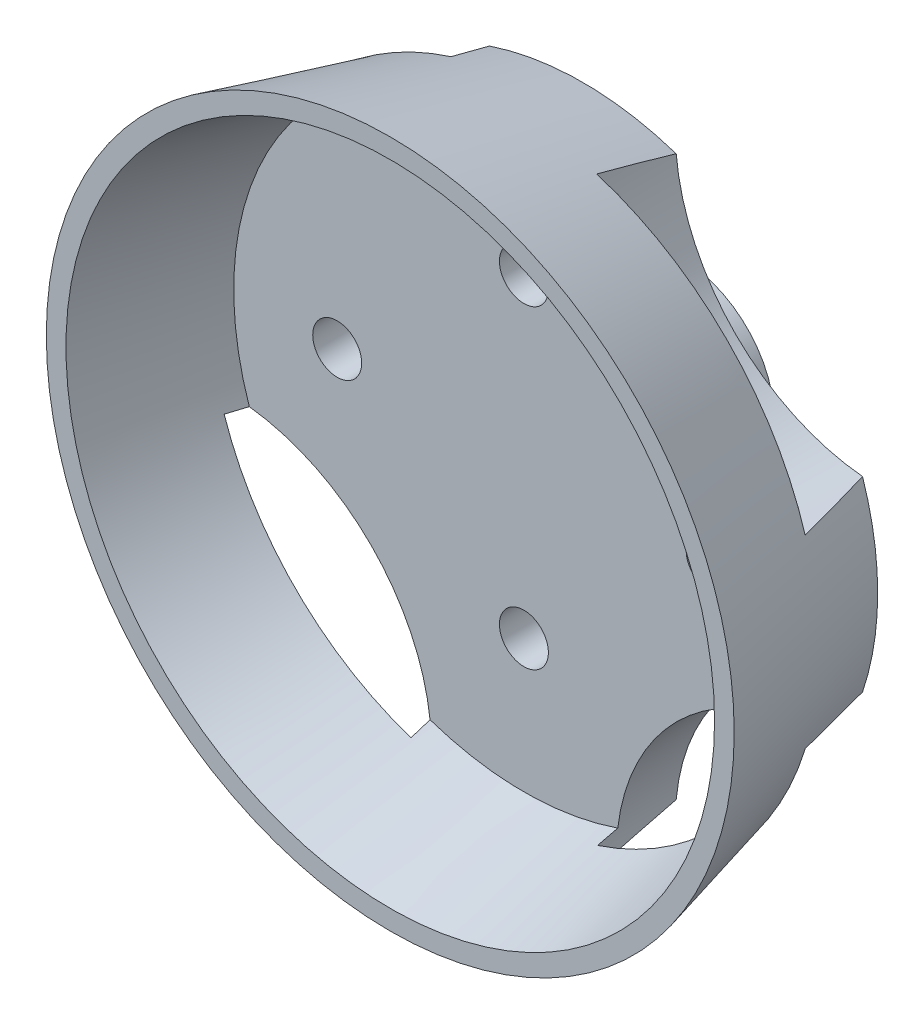
ISO-10303-21;
HEADER;
FILE_DESCRIPTION(('STEP AP214'),'2;1');
FILE_NAME('part.step','',(''),(''),'','','');
FILE_SCHEMA(('AUTOMOTIVE_DESIGN { 1 0 10303 214 1 1 1 1 }'));
ENDSEC;
DATA;
#1=APPLICATION_CONTEXT('core data for automotive mechanical design processes');
#2=APPLICATION_PROTOCOL_DEFINITION('international standard','automotive_design',2000,#1);
#3=PRODUCT_CONTEXT('',#1,'mechanical');
#4=PRODUCT('Part','Part','',(#3));
#5=PRODUCT_RELATED_PRODUCT_CATEGORY('part','',(#4));
#6=PRODUCT_DEFINITION_FORMATION('','',#4);
#7=PRODUCT_DEFINITION_CONTEXT('part definition',#1,'design');
#8=PRODUCT_DEFINITION('design','',#6,#7);
#9=PRODUCT_DEFINITION_SHAPE('','',#8);
#10=(LENGTH_UNIT() NAMED_UNIT(*) SI_UNIT(.MILLI.,.METRE.));
#11=(NAMED_UNIT(*) PLANE_ANGLE_UNIT() SI_UNIT($,.RADIAN.));
#12=(NAMED_UNIT(*) SI_UNIT($,.STERADIAN.) SOLID_ANGLE_UNIT());
#13=UNCERTAINTY_MEASURE_WITH_UNIT(LENGTH_MEASURE(1.E-05),#10,'distance_accuracy_value','');
#14=(GEOMETRIC_REPRESENTATION_CONTEXT(3) GLOBAL_UNCERTAINTY_ASSIGNED_CONTEXT((#13)) GLOBAL_UNIT_ASSIGNED_CONTEXT((#10,
#11,#12)) REPRESENTATION_CONTEXT('',''));
#15=CARTESIAN_POINT('',(0.,0.,0.));
#16=DIRECTION('',(0.,0.,1.));
#17=DIRECTION('',(1.,0.,0.));
#18=AXIS2_PLACEMENT_3D('',#15,#16,#17);
#19=CARTESIAN_POINT('',(0.,0.,-8.));
#20=DIRECTION('',(0.,0.,1.));
#21=DIRECTION('',(1.,0.,0.));
#22=AXIS2_PLACEMENT_3D('',#19,#20,#21);
#23=PLANE('',#22);
#24=CARTESIAN_POINT('',(0.,0.,-8.));
#25=DIRECTION('',(0.,0.,1.));
#26=DIRECTION('',(1.,0.,0.));
#27=AXIS2_PLACEMENT_3D('',#24,#25,#26);
#28=CIRCLE('',#27,4.75);
#29=CARTESIAN_POINT('',(4.75,0.,-8.));
#30=VERTEX_POINT('',#29);
#31=EDGE_CURVE('E166',#30,#30,#28,.T.);
#32=ORIENTED_EDGE('',*,*,#31,.F.);
#33=EDGE_LOOP('',(#32));
#34=FACE_BOUND('',#33,.T.);
#35=ADVANCED_FACE('F34',(#34),#23,.F.);
#36=CARTESIAN_POINT('',(0.,0.,0.));
#37=DIRECTION('',(0.,0.,1.));
#38=DIRECTION('',(1.,0.,0.));
#39=AXIS2_PLACEMENT_3D('',#36,#37,#38);
#40=CYLINDRICAL_SURFACE('',#39,4.75);
#41=CARTESIAN_POINT('',(0.,0.,-3.));
#42=DIRECTION('',(0.,0.,1.));
#43=DIRECTION('',(1.,0.,0.));
#44=AXIS2_PLACEMENT_3D('',#41,#42,#43);
#45=CIRCLE('',#44,4.75);
#46=CARTESIAN_POINT('',(4.75,0.,-3.));
#47=VERTEX_POINT('',#46);
#48=EDGE_CURVE('E161',#47,#47,#45,.T.);
#49=ORIENTED_EDGE('',*,*,#48,.F.);
#50=EDGE_LOOP('',(#49));
#51=FACE_BOUND('',#50,.T.);
#52=ORIENTED_EDGE('',*,*,#31,.T.);
#53=EDGE_LOOP('',(#52));
#54=FACE_BOUND('',#53,.T.);
#55=ADVANCED_FACE('F386',(#51,#54),#40,.T.);
#56=CARTESIAN_POINT('',(0.,4.75,-3.));
#57=DIRECTION('',(0.,0.,1.));
#58=DIRECTION('',(1.,0.,0.));
#59=AXIS2_PLACEMENT_3D('',#56,#57,#58);
#60=PLANE('',#59);
#61=CARTESIAN_POINT('',(0.,-8.,-3.));
#62=DIRECTION('',(0.,0.,-1.));
#63=DIRECTION('',(-1.,0.,0.));
#64=AXIS2_PLACEMENT_3D('',#61,#62,#63);
#65=CIRCLE('',#64,1.245);
#66=CARTESIAN_POINT('',(-1.245,-8.,-3.));
#67=VERTEX_POINT('',#66);
#68=EDGE_CURVE('E200',#67,#67,#65,.T.);
#69=ORIENTED_EDGE('',*,*,#68,.F.);
#70=EDGE_LOOP('',(#69));
#71=FACE_BOUND('',#70,.T.);
#72=CARTESIAN_POINT('',(-9.5,0.,-3.));
#73=DIRECTION('',(0.,0.,-1.));
#74=DIRECTION('',(-1.,0.,0.));
#75=AXIS2_PLACEMENT_3D('',#72,#73,#74);
#76=CIRCLE('',#75,1.245);
#77=CARTESIAN_POINT('',(-10.745,0.,-3.));
#78=VERTEX_POINT('',#77);
#79=EDGE_CURVE('E375',#78,#78,#76,.T.);
#80=ORIENTED_EDGE('',*,*,#79,.F.);
#81=EDGE_LOOP('',(#80));
#82=FACE_BOUND('',#81,.T.);
#83=CARTESIAN_POINT('',(9.5,0.,-3.));
#84=DIRECTION('',(0.,0.,-1.));
#85=DIRECTION('',(-1.,0.,0.));
#86=AXIS2_PLACEMENT_3D('',#83,#84,#85);
#87=CIRCLE('',#86,1.245);
#88=CARTESIAN_POINT('',(8.255,0.,-3.));
#89=VERTEX_POINT('',#88);
#90=EDGE_CURVE('E377',#89,#89,#87,.T.);
#91=ORIENTED_EDGE('',*,*,#90,.F.);
#92=EDGE_LOOP('',(#91));
#93=FACE_BOUND('',#92,.T.);
#94=CARTESIAN_POINT('',(0.,8.,-3.));
#95=DIRECTION('',(0.,0.,-1.));
#96=DIRECTION('',(-1.,0.,0.));
#97=AXIS2_PLACEMENT_3D('',#94,#95,#96);
#98=CIRCLE('',#97,1.245);
#99=CARTESIAN_POINT('',(-1.245,8.,-3.));
#100=VERTEX_POINT('',#99);
#101=EDGE_CURVE('E196',#100,#100,#98,.T.);
#102=ORIENTED_EDGE('',*,*,#101,.F.);
#103=EDGE_LOOP('',(#102));
#104=FACE_BOUND('',#103,.T.);
#105=CARTESIAN_POINT('',(0.,0.,-3.));
#106=DIRECTION('',(0.,0.,1.));
#107=DIRECTION('',(1.,0.,0.));
#108=AXIS2_PLACEMENT_3D('',#105,#106,#107);
#109=CIRCLE('',#108,15.);
#110=CARTESIAN_POINT('',(-14.2286948358024,4.7480778499946,-3.));
#111=VERTEX_POINT('',#110);
#112=CARTESIAN_POINT('',(-14.2286948358023,-4.7480778499949,-3.));
#113=VERTEX_POINT('',#112);
#114=EDGE_CURVE('E154',#111,#113,#109,.T.);
#115=ORIENTED_EDGE('',*,*,#114,.F.);
#116=CARTESIAN_POINT('',(-15.2027957955109,15.2027957955106,-3.));
#117=DIRECTION('',(0.,0.,-1.));
#118=DIRECTION('',(-1.,0.,0.));
#119=AXIS2_PLACEMENT_3D('',#116,#117,#118);
#120=CIRCLE('',#119,10.5);
#121=CARTESIAN_POINT('',(-4.74807784999485,14.2286948358023,-3.));
#122=VERTEX_POINT('',#121);
#123=EDGE_CURVE('E141',#122,#111,#120,.T.);
#124=ORIENTED_EDGE('',*,*,#123,.F.);
#125=CARTESIAN_POINT('',(4.74807784999465,14.2286948358024,-3.));
#126=VERTEX_POINT('',#125);
#127=EDGE_CURVE('E152',#126,#122,#109,.T.);
#128=ORIENTED_EDGE('',*,*,#127,.F.);
#129=CARTESIAN_POINT('',(15.2027957955107,15.2027957955109,-3.));
#130=DIRECTION('',(0.,0.,-1.));
#131=DIRECTION('',(-1.,0.,0.));
#132=AXIS2_PLACEMENT_3D('',#129,#130,#131);
#133=CIRCLE('',#132,10.5);
#134=CARTESIAN_POINT('',(14.2286948358024,4.7480778499948,-3.));
#135=VERTEX_POINT('',#134);
#136=EDGE_CURVE('E367',#135,#126,#133,.T.);
#137=ORIENTED_EDGE('',*,*,#136,.F.);
#138=CARTESIAN_POINT('',(14.2286948358024,-4.7480778499947,-3.));
#139=VERTEX_POINT('',#138);
#140=EDGE_CURVE('E163',#139,#135,#109,.T.);
#141=ORIENTED_EDGE('',*,*,#140,.F.);
#142=CARTESIAN_POINT('',(15.2027957955108,-15.2027957955107,-3.));
#143=DIRECTION('',(0.,0.,-1.));
#144=DIRECTION('',(-1.,0.,0.));
#145=AXIS2_PLACEMENT_3D('',#142,#143,#144);
#146=CIRCLE('',#145,10.5);
#147=CARTESIAN_POINT('',(4.74807784999475,-14.2286948358024,-3.));
#148=VERTEX_POINT('',#147);
#149=EDGE_CURVE('E183',#148,#139,#146,.T.);
#150=ORIENTED_EDGE('',*,*,#149,.F.);
#151=CARTESIAN_POINT('',(-4.74807784999455,-14.2286948358024,-3.));
#152=VERTEX_POINT('',#151);
#153=EDGE_CURVE('E164',#152,#148,#109,.T.);
#154=ORIENTED_EDGE('',*,*,#153,.F.);
#155=CARTESIAN_POINT('',(-15.2027957955106,-15.202795795511,-3.));
#156=DIRECTION('',(0.,0.,-1.));
#157=DIRECTION('',(-1.,0.,0.));
#158=AXIS2_PLACEMENT_3D('',#155,#156,#157);
#159=CIRCLE('',#158,10.5);
#160=EDGE_CURVE('E181',#113,#152,#159,.T.);
#161=ORIENTED_EDGE('',*,*,#160,.F.);
#162=EDGE_LOOP('',(#115,#124,#128,#137,#141,#150,#154,#161));
#163=FACE_BOUND('',#162,.T.);
#164=ORIENTED_EDGE('',*,*,#48,.T.);
#165=EDGE_LOOP('',(#164));
#166=FACE_BOUND('',#165,.T.);
#167=ADVANCED_FACE('F149',(#71,#82,#93,#104,#163,#166),#60,.F.);
#168=CARTESIAN_POINT('',(0.,0.,-3.));
#169=DIRECTION('',(0.,0.,1.));
#170=DIRECTION('',(1.,0.,0.));
#171=AXIS2_PLACEMENT_3D('',#168,#169,#170);
#172=CONICAL_SURFACE('',#171,15.,0.249774789421248);
#173=CARTESIAN_POINT('',(0.,0.,6.8));
#174=DIRECTION('',(0.,0.,1.));
#175=DIRECTION('',(1.,0.,0.));
#176=AXIS2_PLACEMENT_3D('',#173,#174,#175);
#177=CIRCLE('',#176,17.5);
#178=CARTESIAN_POINT('',(17.5,0.,6.8));
#179=VERTEX_POINT('',#178);
#180=EDGE_CURVE('E170',#179,#179,#177,.T.);
#181=ORIENTED_EDGE('',*,*,#180,.F.);
#182=EDGE_LOOP('',(#181));
#183=FACE_BOUND('',#182,.T.);
#184=CARTESIAN_POINT('',(0.,0.,-1.));
#185=DIRECTION('',(0.,0.,-1.));
#186=DIRECTION('',(-1.,0.,0.));
#187=AXIS2_PLACEMENT_3D('',#184,#185,#186);
#188=CIRCLE('',#187,15.5102040816327);
#189=CARTESIAN_POINT('',(-14.7773120394279,4.71142011958951,-1.));
#190=VERTEX_POINT('',#189);
#191=CARTESIAN_POINT('',(-4.71142011958976,14.7773120394278,-1.));
#192=VERTEX_POINT('',#191);
#193=EDGE_CURVE('E145',#190,#192,#188,.T.);
#194=ORIENTED_EDGE('',*,*,#193,.F.);
#195=CARTESIAN_POINT('',(-14.7773662916707,4.7114179194992,-0.999799999999991));
#196=CARTESIAN_POINT('',(-14.6868755313093,4.71505833842477,-1.33350963740283));
#197=CARTESIAN_POINT('',(-14.5959029042434,4.71993397308717,-1.66706445448587));
#198=CARTESIAN_POINT('',(-14.4129939149253,4.73215567400436,-2.33386445449184));
#199=CARTESIAN_POINT('',(-14.3210575526543,4.73950174030717,-2.66710963740876));
#200=CARTESIAN_POINT('',(-14.2286393236601,4.74808302239481,-3.00019999999985));
#201=B_SPLINE_CURVE_WITH_KNOTS('',3,(#195,#196,#197,#198,#199,#200),.UNSPECIFIED.,.F.,.F.,(4,2,
4),(0.,1.03731743463194,2.0746348894237),.UNSPECIFIED.);
#202=EDGE_CURVE('E11',#190,#111,#201,.T.);
#203=ORIENTED_EDGE('',*,*,#202,.T.);
#204=ORIENTED_EDGE('',*,*,#114,.T.);
#205=CARTESIAN_POINT('',(-14.22863932366,-4.74808302239511,-3.00019999999985));
#206=CARTESIAN_POINT('',(-14.3210043075568,-4.73947920386482,-2.66741546386221));
#207=CARTESIAN_POINT('',(-14.4128471106882,-4.73215344896793,-2.33445398119699));
#208=CARTESIAN_POINT('',(-14.5955655865722,-4.719968472237,-1.66824012667558));
#209=CARTESIAN_POINT('',(-14.6864413120366,-4.71510911528754,-1.33498777175623));
#210=CARTESIAN_POINT('',(-14.8673128569668,-4.70776642164095,-0.668219106112294));
#211=CARTESIAN_POINT('',(-14.9573086775008,-4.70528308205886,-0.334702795708691));
#212=CARTESIAN_POINT('',(-15.1364881202475,-4.70262330185298,0.332576819501213));
#213=CARTESIAN_POINT('',(-15.2256716976931,-4.70244698762179,0.666340136838243));
#214=CARTESIAN_POINT('',(-15.3144780261259,-4.70338976091239,1.0002));
#215=B_SPLINE_CURVE_WITH_KNOTS('',3,(#205,#206,#207,#208,#209,#210,#211,#212,#213,#214),
.UNSPECIFIED.,.F.,.F.,(4,2,2,2,4),(0.,1.03641158864925,2.0727663939649,3.10911994094034,
4.14553026530314),.UNSPECIFIED.);
#216=CARTESIAN_POINT('',(-15.3144248274739,-4.70338919517287,0.999999999999999));
#217=VERTEX_POINT('',#216);
#218=EDGE_CURVE('E235',#113,#217,#215,.T.);
#219=ORIENTED_EDGE('',*,*,#218,.T.);
#220=CARTESIAN_POINT('',(0.,0.,0.999999999999999));
#221=DIRECTION('',(0.,0.,-1.));
#222=DIRECTION('',(-1.,0.,0.));
#223=AXIS2_PLACEMENT_3D('',#220,#221,#222);
#224=CIRCLE('',#223,16.0204081632653);
#225=CARTESIAN_POINT('',(-4.7033891951725,-15.314424827474,0.999999999999999));
#226=VERTEX_POINT('',#225);
#227=EDGE_CURVE('E357',#226,#217,#224,.T.);
#228=ORIENTED_EDGE('',*,*,#227,.F.);
#229=CARTESIAN_POINT('',(-4.70338976091202,-15.314478026126,1.0002));
#230=CARTESIAN_POINT('',(-4.70244698762142,-15.2256716976932,0.666340136838243));
#231=CARTESIAN_POINT('',(-4.70262330185261,-15.1364881202476,0.332576819501214));
#232=CARTESIAN_POINT('',(-4.7052830820585,-14.9573086775009,-0.33470279570869));
#233=CARTESIAN_POINT('',(-4.70776642164059,-14.8673128569669,-0.668219106112293));
#234=CARTESIAN_POINT('',(-4.71510911528718,-14.6864413120367,-1.33498777175623));
#235=CARTESIAN_POINT('',(-4.71996847223665,-14.5955655865723,-1.66824012667558));
#236=CARTESIAN_POINT('',(-4.73215344896758,-14.4128471106883,-2.33445398119699));
#237=CARTESIAN_POINT('',(-4.73947920386447,-14.3210043075569,-2.66741546386221));
#238=CARTESIAN_POINT('',(-4.74808302239477,-14.2286393236601,-3.00019999999985));
#239=B_SPLINE_CURVE_WITH_KNOTS('',3,(#229,#230,#231,#232,#233,#234,#235,#236,#237,#238),
.UNSPECIFIED.,.F.,.F.,(4,2,2,2,4),(0.,1.0364103243628,2.07276387133824,3.10911867665389,
4.14553026530314),.UNSPECIFIED.);
#240=EDGE_CURVE('E179',#226,#152,#239,.T.);
#241=ORIENTED_EDGE('',*,*,#240,.T.);
#242=ORIENTED_EDGE('',*,*,#153,.T.);
#243=CARTESIAN_POINT('',(4.74808302239496,-14.22863932366,-3.00019999999985));
#244=CARTESIAN_POINT('',(4.73947920386466,-14.3210043075569,-2.66741546386221));
#245=CARTESIAN_POINT('',(4.73215344896778,-14.4128471106883,-2.33445398119699));
#246=CARTESIAN_POINT('',(4.71996847223684,-14.5955655865722,-1.66824012667558));
#247=CARTESIAN_POINT('',(4.71510911528739,-14.6864413120367,-1.33498777175623));
#248=CARTESIAN_POINT('',(4.70776642164079,-14.8673128569669,-0.668219106112296));
#249=CARTESIAN_POINT('',(4.7052830820587,-14.9573086775009,-0.334702795708693));
#250=CARTESIAN_POINT('',(4.70262330185282,-15.1364881202475,0.332576819501212));
#251=CARTESIAN_POINT('',(4.70244698762163,-15.2256716976932,0.666340136838241));
#252=CARTESIAN_POINT('',(4.70338976091223,-15.3144780261259,1.0002));
#253=B_SPLINE_CURVE_WITH_KNOTS('',3,(#243,#244,#245,#246,#247,#248,#249,#250,#251,#252),
.UNSPECIFIED.,.F.,.F.,(4,2,2,2,4),(0.,1.03641158864925,2.0727663939649,3.10911994094034,
4.14553026530314),.UNSPECIFIED.);
#254=CARTESIAN_POINT('',(4.70338919517271,-15.3144248274739,0.999999999999999));
#255=VERTEX_POINT('',#254);
#256=EDGE_CURVE('E176',#148,#255,#253,.T.);
#257=ORIENTED_EDGE('',*,*,#256,.T.);
#258=CARTESIAN_POINT('',(0.,0.,0.999999999999999));
#259=DIRECTION('',(0.,0.,-1.));
#260=DIRECTION('',(-1.,0.,0.));
#261=AXIS2_PLACEMENT_3D('',#258,#259,#260);
#262=CIRCLE('',#261,16.0204081632653);
#263=CARTESIAN_POINT('',(15.314424827474,-4.70338919517266,0.999999999999999));
#264=VERTEX_POINT('',#263);
#265=EDGE_CURVE('E568',#264,#255,#262,.T.);
#266=ORIENTED_EDGE('',*,*,#265,.F.);
#267=CARTESIAN_POINT('',(15.3144780261259,-4.70338976091218,1.0002));
#268=CARTESIAN_POINT('',(15.2256716976932,-4.70244698762158,0.666340136838229));
#269=CARTESIAN_POINT('',(15.1364881202475,-4.70262330185277,0.332576819501186));
#270=CARTESIAN_POINT('',(14.9573086775009,-4.70528308205865,-0.334702795708744));
#271=CARTESIAN_POINT('',(14.8673128569669,-4.70776642164074,-0.668219106112358));
#272=CARTESIAN_POINT('',(14.6864413120367,-4.71510911528734,-1.33498777175632));
#273=CARTESIAN_POINT('',(14.5955655865722,-4.7199684722368,-1.66824012667568));
#274=CARTESIAN_POINT('',(14.4128471106882,-4.73215344896773,-2.33445398119711));
#275=CARTESIAN_POINT('',(14.3210043075569,-4.73947920386462,-2.66741546386235));
#276=CARTESIAN_POINT('',(14.22863932366,-4.74808302239492,-3.0002));
#277=B_SPLINE_CURVE_WITH_KNOTS('',3,(#267,#268,#269,#270,#271,#272,#273,#274,#275,#276),
.UNSPECIFIED.,.F.,.F.,(4,2,2,2,4),(0.,1.03641032436284,2.07276387133832,3.10911867665401,
4.1455302653033),.UNSPECIFIED.);
#278=EDGE_CURVE('E279',#264,#139,#277,.T.);
#279=ORIENTED_EDGE('',*,*,#278,.T.);
#280=ORIENTED_EDGE('',*,*,#140,.T.);
#281=CARTESIAN_POINT('',(14.22863932366,4.74808302239502,-3.0002));
#282=CARTESIAN_POINT('',(14.3210043075568,4.73947920386472,-2.66741546386235));
#283=CARTESIAN_POINT('',(14.4128471106882,4.73215344896784,-2.33445398119711));
#284=CARTESIAN_POINT('',(14.5955655865722,4.7199684722369,-1.66824012667568));
#285=CARTESIAN_POINT('',(14.6864413120366,4.71510911528744,-1.33498777175632));
#286=CARTESIAN_POINT('',(14.8673128569668,4.70776642164085,-0.668219106112358));
#287=CARTESIAN_POINT('',(14.9573086775008,4.70528308205876,-0.334702795708743));
#288=CARTESIAN_POINT('',(15.1364881202475,4.70262330185288,0.332576819501187));
#289=CARTESIAN_POINT('',(15.2256716976931,4.70244698762169,0.666340136838229));
#290=CARTESIAN_POINT('',(15.3144780261259,4.70338976091228,1.0002));
#291=B_SPLINE_CURVE_WITH_KNOTS('',3,(#281,#282,#283,#284,#285,#286,#287,#288,#289,#290),
.UNSPECIFIED.,.F.,.F.,(4,2,2,2,4),(0.,1.03641158864929,2.07276639396497,3.10911994094046,
4.1455302653033),.UNSPECIFIED.);
#292=CARTESIAN_POINT('',(15.3144248274739,4.70338919517276,0.999999999999999));
#293=VERTEX_POINT('',#292);
#294=EDGE_CURVE('E257',#135,#293,#291,.T.);
#295=ORIENTED_EDGE('',*,*,#294,.T.);
#296=CARTESIAN_POINT('',(0.,0.,0.999999999999999));
#297=DIRECTION('',(0.,0.,-1.));
#298=DIRECTION('',(-1.,0.,0.));
#299=AXIS2_PLACEMENT_3D('',#296,#297,#298);
#300=CIRCLE('',#299,16.0204081632653);
#301=CARTESIAN_POINT('',(4.7033891951726,15.314424827474,0.999999999999999));
#302=VERTEX_POINT('',#301);
#303=EDGE_CURVE('E577',#302,#293,#300,.T.);
#304=ORIENTED_EDGE('',*,*,#303,.F.);
#305=CARTESIAN_POINT('',(4.70338976091212,15.314478026126,1.0002));
#306=CARTESIAN_POINT('',(4.70244698762153,15.2256716976932,0.666340136838229));
#307=CARTESIAN_POINT('',(4.70262330185272,15.1364881202475,0.332576819501187));
#308=CARTESIAN_POINT('',(4.7052830820586,14.9573086775009,-0.334702795708743));
#309=CARTESIAN_POINT('',(4.70776642164069,14.8673128569669,-0.668219106112358));
#310=CARTESIAN_POINT('',(4.71510911528729,14.6864413120367,-1.33498777175632));
#311=CARTESIAN_POINT('',(4.71996847223675,14.5955655865722,-1.66824012667569));
#312=CARTESIAN_POINT('',(4.73215344896768,14.4128471106883,-2.33445398119711));
#313=CARTESIAN_POINT('',(4.73947920386457,14.3210043075569,-2.66741546386235));
#314=CARTESIAN_POINT('',(4.74808302239487,14.22863932366,-3.0002));
#315=B_SPLINE_CURVE_WITH_KNOTS('',3,(#305,#306,#307,#308,#309,#310,#311,#312,#313,#314),
.UNSPECIFIED.,.F.,.F.,(4,2,2,2,4),(0.,1.03641032436284,2.07276387133832,3.10911867665401,
4.1455302653033),.UNSPECIFIED.);
#316=EDGE_CURVE('E160',#302,#126,#315,.T.);
#317=ORIENTED_EDGE('',*,*,#316,.T.);
#318=ORIENTED_EDGE('',*,*,#127,.T.);
#319=CARTESIAN_POINT('',(-4.74808302239506,14.2286393236599,-3.0002));
#320=CARTESIAN_POINT('',(-4.73950174030742,14.3210575526542,-2.66710963740888));
#321=CARTESIAN_POINT('',(-4.73215567400462,14.4129939149252,-2.33386445449195));
#322=CARTESIAN_POINT('',(-4.71993397308742,14.5959029042433,-1.66706445448593));
#323=CARTESIAN_POINT('',(-4.71505833842503,14.6868755313092,-1.33350963740287));
#324=CARTESIAN_POINT('',(-4.71141791949945,14.7773662916706,-0.999800000000001));
#325=B_SPLINE_CURVE_WITH_KNOTS('',3,(#319,#320,#321,#322,#323,#324),.UNSPECIFIED.,.F.,.F.,(4,2,
4),(0.,1.03731745479184,2.07463488942385),.UNSPECIFIED.);
#326=EDGE_CURVE('E47',#122,#192,#325,.T.);
#327=ORIENTED_EDGE('',*,*,#326,.T.);
#328=EDGE_LOOP('',(#194,#203,#204,#219,#228,#241,#242,#257,#266,#279,#280,#295,#304,#317,#318,#327));
#329=FACE_BOUND('',#328,.T.);
#330=ADVANCED_FACE('F157',(#183,#329),#172,.T.);
#331=CARTESIAN_POINT('',(0.,17.5,6.8));
#332=DIRECTION('',(0.,0.,-1.));
#333=DIRECTION('',(-1.,0.,0.));
#334=AXIS2_PLACEMENT_3D('',#331,#332,#333);
#335=PLANE('',#334);
#336=CARTESIAN_POINT('',(0.,0.,6.8));
#337=DIRECTION('',(0.,0.,1.));
#338=DIRECTION('',(1.,0.,0.));
#339=AXIS2_PLACEMENT_3D('',#336,#337,#338);
#340=CIRCLE('',#339,16.5);
#341=CARTESIAN_POINT('',(16.5,0.,6.8));
#342=VERTEX_POINT('',#341);
#343=EDGE_CURVE('E567',#342,#342,#340,.T.);
#344=ORIENTED_EDGE('',*,*,#343,.F.);
#345=EDGE_LOOP('',(#344));
#346=FACE_BOUND('',#345,.T.);
#347=ORIENTED_EDGE('',*,*,#180,.T.);
#348=EDGE_LOOP('',(#347));
#349=FACE_BOUND('',#348,.T.);
#350=ADVANCED_FACE('F249',(#346,#349),#335,.F.);
#351=CARTESIAN_POINT('',(0.,0.,6.8));
#352=DIRECTION('',(0.,0.,1.));
#353=DIRECTION('',(1.,0.,0.));
#354=AXIS2_PLACEMENT_3D('',#351,#352,#353);
#355=CONICAL_SURFACE('',#354,16.5,0.249774789421248);
#356=CARTESIAN_POINT('',(0.,0.,0.999999999999999));
#357=DIRECTION('',(0.,0.,-1.));
#358=DIRECTION('',(-1.,0.,0.));
#359=AXIS2_PLACEMENT_3D('',#356,#357,#358);
#360=CIRCLE('',#359,15.0204081632653);
#361=CARTESIAN_POINT('',(4.74603374222803,-14.2508885726021,0.999999999999999));
#362=VERTEX_POINT('',#361);
#363=CARTESIAN_POINT('',(14.2508885726021,-4.74603374222799,0.999999999999999));
#364=VERTEX_POINT('',#363);
#365=EDGE_CURVE('E359',#362,#364,#360,.F.);
#366=ORIENTED_EDGE('',*,*,#365,.F.);
#367=CARTESIAN_POINT('',(4.74602869401075,-14.2509440292223,1.0002));
#368=CARTESIAN_POINT('',(4.75023447588354,-14.2046902864514,0.833370291506868));
#369=CARTESIAN_POINT('',(4.75476910163571,-14.1582982429152,0.666588770765415));
#370=CARTESIAN_POINT('',(4.76449604091889,-14.0652375541203,0.33312210409835));
#371=CARTESIAN_POINT('',(4.76968835445261,-14.0185689088605,0.166436958173137));
#372=CARTESIAN_POINT('',(4.77520951186842,-13.9717619628343,-0.000200000000000398));
#373=B_SPLINE_CURVE_WITH_KNOTS('',3,(#367,#368,#369,#370,#371,#372),.UNSPECIFIED.,.F.,.F.,(4,2,
4),(0.,0.519518759772059,1.03903752168632),.UNSPECIFIED.);
#374=CARTESIAN_POINT('',(4.77520287908659,-13.9718181477284,0.));
#375=VERTEX_POINT('',#374);
#376=EDGE_CURVE('E557',#362,#375,#373,.T.);
#377=ORIENTED_EDGE('',*,*,#376,.T.);
#378=CARTESIAN_POINT('',(0.,0.,0.));
#379=DIRECTION('',(0.,0.,1.));
#380=DIRECTION('',(1.,0.,0.));
#381=AXIS2_PLACEMENT_3D('',#378,#379,#380);
#382=CIRCLE('',#381,14.765306122449);
#383=CARTESIAN_POINT('',(-4.7752028790864,-13.9718181477285,0.));
#384=VERTEX_POINT('',#383);
#385=EDGE_CURVE('E565',#384,#375,#382,.T.);
#386=ORIENTED_EDGE('',*,*,#385,.F.);
#387=CARTESIAN_POINT('',(-4.77520951186826,-13.9717619628344,-0.000199999999994334));
#388=CARTESIAN_POINT('',(-4.76968835445243,-14.0185689088606,0.166436958173141));
#389=CARTESIAN_POINT('',(-4.76449604091871,-14.0652375541204,0.333122104098352));
#390=CARTESIAN_POINT('',(-4.75476910163551,-14.1582982429152,0.666588770765413));
#391=CARTESIAN_POINT('',(-4.75023447588333,-14.2046902864515,0.833370291506865));
#392=CARTESIAN_POINT('',(-4.74602869401053,-14.2509440292224,1.0002));
#393=B_SPLINE_CURVE_WITH_KNOTS('',3,(#387,#388,#389,#390,#391,#392),.UNSPECIFIED.,.F.,.F.,(4,2,
4),(0.,0.519518761914259,1.03903752168632),.UNSPECIFIED.);
#394=CARTESIAN_POINT('',(-4.74603374222784,-14.2508885726021,0.999999999999999));
#395=VERTEX_POINT('',#394);
#396=EDGE_CURVE('E201',#384,#395,#393,.T.);
#397=ORIENTED_EDGE('',*,*,#396,.T.);
#398=CARTESIAN_POINT('',(0.,0.,0.999999999999999));
#399=DIRECTION('',(0.,0.,-1.));
#400=DIRECTION('',(-1.,0.,0.));
#401=AXIS2_PLACEMENT_3D('',#398,#399,#400);
#402=CIRCLE('',#401,15.0204081632653);
#403=CARTESIAN_POINT('',(-14.250888572602,-4.74603374222819,0.999999999999999));
#404=VERTEX_POINT('',#403);
#405=EDGE_CURVE('E343',#404,#395,#402,.F.);
#406=ORIENTED_EDGE('',*,*,#405,.F.);
#407=CARTESIAN_POINT('',(-14.2509440292223,-4.7460286940109,1.0002));
#408=CARTESIAN_POINT('',(-14.2046902864513,-4.75023447588369,0.833370291506868));
#409=CARTESIAN_POINT('',(-14.1582982429151,-4.75476910163586,0.666588770765414));
#410=CARTESIAN_POINT('',(-14.0652375541202,-4.76449604091904,0.33312210409835));
#411=CARTESIAN_POINT('',(-14.0185689088605,-4.76968835445275,0.166436958173137));
#412=CARTESIAN_POINT('',(-13.9717619628343,-4.77520951186857,-0.000199999999999861));
#413=B_SPLINE_CURVE_WITH_KNOTS('',3,(#407,#408,#409,#410,#411,#412),.UNSPECIFIED.,.F.,.F.,(4,2,
4),(0.,0.519518759772059,1.03903752168632),.UNSPECIFIED.);
#414=CARTESIAN_POINT('',(-13.9718181477283,-4.77520287908673,0.));
#415=VERTEX_POINT('',#414);
#416=EDGE_CURVE('E210',#404,#415,#413,.T.);
#417=ORIENTED_EDGE('',*,*,#416,.T.);
#418=CARTESIAN_POINT('',(4.7752028790865,13.9718181477284,0.));
#419=VERTEX_POINT('',#418);
#420=EDGE_CURVE('E330',#419,#415,#382,.T.);
#421=ORIENTED_EDGE('',*,*,#420,.F.);
#422=CARTESIAN_POINT('',(4.77520951186836,13.9717619628343,-0.000200000000000195));
#423=CARTESIAN_POINT('',(4.76968835445253,14.0185689088605,0.166436958173135));
#424=CARTESIAN_POINT('',(4.7644960409188,14.0652375541203,0.333122104098347));
#425=CARTESIAN_POINT('',(4.75476910163561,14.1582982429152,0.666588770765409));
#426=CARTESIAN_POINT('',(4.75023447588342,14.2046902864514,0.833370291506863));
#427=CARTESIAN_POINT('',(4.74602869401063,14.2509440292224,1.00019999999999));
#428=B_SPLINE_CURVE_WITH_KNOTS('',3,(#422,#423,#424,#425,#426,#427),.UNSPECIFIED.,.F.,.F.,(4,2,
4),(0.,0.519518761914262,1.03903752168632),.UNSPECIFIED.);
#429=CARTESIAN_POINT('',(4.74603374222794,14.2508885726021,0.999999999999999));
#430=VERTEX_POINT('',#429);
#431=EDGE_CURVE('E306',#419,#430,#428,.T.);
#432=ORIENTED_EDGE('',*,*,#431,.T.);
#433=CARTESIAN_POINT('',(0.,0.,0.999999999999999));
#434=DIRECTION('',(0.,0.,-1.));
#435=DIRECTION('',(-1.,0.,0.));
#436=AXIS2_PLACEMENT_3D('',#433,#434,#435);
#437=CIRCLE('',#436,15.0204081632653);
#438=CARTESIAN_POINT('',(14.250888572602,4.74603374222809,0.999999999999999));
#439=VERTEX_POINT('',#438);
#440=EDGE_CURVE('E327',#439,#430,#437,.F.);
#441=ORIENTED_EDGE('',*,*,#440,.F.);
#442=CARTESIAN_POINT('',(14.2509440292223,4.74602869401081,1.0002));
#443=CARTESIAN_POINT('',(14.2046902864514,4.75023447588359,0.833370291506866));
#444=CARTESIAN_POINT('',(14.1582982429151,4.75476910163577,0.666588770765411));
#445=CARTESIAN_POINT('',(14.0652375541203,4.76449604091894,0.333122104098346));
#446=CARTESIAN_POINT('',(14.0185689088605,4.76968835445266,0.166436958173132));
#447=CARTESIAN_POINT('',(13.9717619628343,4.77520951186848,-0.000200000000005406));
#448=B_SPLINE_CURVE_WITH_KNOTS('',3,(#442,#443,#444,#445,#446,#447),.UNSPECIFIED.,.F.,.F.,(4,2,
4),(0.,0.519518759772061,1.03903752168632),.UNSPECIFIED.);
#449=CARTESIAN_POINT('',(13.9718181477284,4.77520287908665,0.));
#450=VERTEX_POINT('',#449);
#451=EDGE_CURVE('E312',#439,#450,#448,.T.);
#452=ORIENTED_EDGE('',*,*,#451,.T.);
#453=CARTESIAN_POINT('',(13.9718181477284,-4.77520287908654,0.));
#454=VERTEX_POINT('',#453);
#455=EDGE_CURVE('E339',#454,#450,#382,.T.);
#456=ORIENTED_EDGE('',*,*,#455,.F.);
#457=CARTESIAN_POINT('',(13.9717619628343,-4.7752095118684,-0.000199999999999893));
#458=CARTESIAN_POINT('',(14.0185689088605,-4.76968835445258,0.166436958173136));
#459=CARTESIAN_POINT('',(14.0652375541203,-4.76449604091885,0.333122104098348));
#460=CARTESIAN_POINT('',(14.1582982429152,-4.75476910163565,0.66658877076541));
#461=CARTESIAN_POINT('',(14.2046902864514,-4.75023447588347,0.833370291506863));
#462=CARTESIAN_POINT('',(14.2509440292223,-4.74602869401068,1.00019999999999));
#463=B_SPLINE_CURVE_WITH_KNOTS('',3,(#457,#458,#459,#460,#461,#462),.UNSPECIFIED.,.F.,.F.,(4,2,
4),(0.,0.519518761914261,1.03903752168632),.UNSPECIFIED.);
#464=EDGE_CURVE('E551',#454,#364,#463,.T.);
#465=ORIENTED_EDGE('',*,*,#464,.T.);
#466=EDGE_LOOP('',(#366,#377,#386,#397,#406,#417,#421,#432,#441,#452,#456,#465));
#467=FACE_BOUND('',#466,.T.);
#468=ORIENTED_EDGE('',*,*,#343,.T.);
#469=EDGE_LOOP('',(#468));
#470=FACE_BOUND('',#469,.T.);
#471=ADVANCED_FACE('F216',(#467,#470),#355,.F.);
#472=CARTESIAN_POINT('',(0.,14.765306122449,0.));
#473=DIRECTION('',(0.,0.,-1.));
#474=DIRECTION('',(-1.,0.,0.));
#475=AXIS2_PLACEMENT_3D('',#472,#473,#474);
#476=PLANE('',#475);
#477=CARTESIAN_POINT('',(0.,-8.,0.));
#478=DIRECTION('',(0.,0.,-1.));
#479=DIRECTION('',(-1.,0.,0.));
#480=AXIS2_PLACEMENT_3D('',#477,#478,#479);
#481=CIRCLE('',#480,1.245);
#482=CARTESIAN_POINT('',(-1.245,-8.,0.));
#483=VERTEX_POINT('',#482);
#484=EDGE_CURVE('E354',#483,#483,#481,.T.);
#485=ORIENTED_EDGE('',*,*,#484,.T.);
#486=EDGE_LOOP('',(#485));
#487=FACE_BOUND('',#486,.T.);
#488=CARTESIAN_POINT('',(-9.5,0.,0.));
#489=DIRECTION('',(0.,0.,-1.));
#490=DIRECTION('',(-1.,0.,0.));
#491=AXIS2_PLACEMENT_3D('',#488,#489,#490);
#492=CIRCLE('',#491,1.245);
#493=CARTESIAN_POINT('',(-10.745,0.,0.));
#494=VERTEX_POINT('',#493);
#495=EDGE_CURVE('E351',#494,#494,#492,.T.);
#496=ORIENTED_EDGE('',*,*,#495,.T.);
#497=EDGE_LOOP('',(#496));
#498=FACE_BOUND('',#497,.T.);
#499=CARTESIAN_POINT('',(9.5,0.,0.));
#500=DIRECTION('',(0.,0.,-1.));
#501=DIRECTION('',(-1.,0.,0.));
#502=AXIS2_PLACEMENT_3D('',#499,#500,#501);
#503=CIRCLE('',#502,1.245);
#504=CARTESIAN_POINT('',(8.255,0.,0.));
#505=VERTEX_POINT('',#504);
#506=EDGE_CURVE('E348',#505,#505,#503,.T.);
#507=ORIENTED_EDGE('',*,*,#506,.T.);
#508=EDGE_LOOP('',(#507));
#509=FACE_BOUND('',#508,.T.);
#510=CARTESIAN_POINT('',(0.,8.,0.));
#511=DIRECTION('',(0.,0.,-1.));
#512=DIRECTION('',(-1.,0.,0.));
#513=AXIS2_PLACEMENT_3D('',#510,#511,#512);
#514=CIRCLE('',#513,1.245);
#515=CARTESIAN_POINT('',(-1.245,8.,0.));
#516=VERTEX_POINT('',#515);
#517=EDGE_CURVE('E199',#516,#516,#514,.T.);
#518=ORIENTED_EDGE('',*,*,#517,.T.);
#519=EDGE_LOOP('',(#518));
#520=FACE_BOUND('',#519,.T.);
#521=ORIENTED_EDGE('',*,*,#385,.T.);
#522=CARTESIAN_POINT('',(15.2027957955108,-15.2027957955107,0.));
#523=DIRECTION('',(0.,0.,-1.));
#524=DIRECTION('',(-1.,0.,0.));
#525=AXIS2_PLACEMENT_3D('',#522,#523,#524);
#526=CIRCLE('',#525,10.5);
#527=EDGE_CURVE('E340',#375,#454,#526,.T.);
#528=ORIENTED_EDGE('',*,*,#527,.T.);
#529=ORIENTED_EDGE('',*,*,#455,.T.);
#530=CARTESIAN_POINT('',(15.2027957955107,15.2027957955109,0.));
#531=DIRECTION('',(0.,0.,-1.));
#532=DIRECTION('',(-1.,0.,0.));
#533=AXIS2_PLACEMENT_3D('',#530,#531,#532);
#534=CIRCLE('',#533,10.5);
#535=EDGE_CURVE('E333',#450,#419,#534,.T.);
#536=ORIENTED_EDGE('',*,*,#535,.T.);
#537=ORIENTED_EDGE('',*,*,#420,.T.);
#538=CARTESIAN_POINT('',(-15.2027957955106,-15.202795795511,0.));
#539=DIRECTION('',(0.,0.,-1.));
#540=DIRECTION('',(-1.,0.,0.));
#541=AXIS2_PLACEMENT_3D('',#538,#539,#540);
#542=CIRCLE('',#541,10.5);
#543=EDGE_CURVE('E341',#415,#384,#542,.T.);
#544=ORIENTED_EDGE('',*,*,#543,.T.);
#545=EDGE_LOOP('',(#521,#528,#529,#536,#537,#544));
#546=FACE_BOUND('',#545,.T.);
#547=ADVANCED_FACE('F336',(#487,#498,#509,#520,#546),#476,.F.);
#548=CARTESIAN_POINT('',(0.,8.,0.999999999999999));
#549=DIRECTION('',(0.,0.,-1.));
#550=DIRECTION('',(-1.,0.,0.));
#551=AXIS2_PLACEMENT_3D('',#548,#549,#550);
#552=CYLINDRICAL_SURFACE('',#551,1.245);
#553=ORIENTED_EDGE('',*,*,#101,.T.);
#554=EDGE_LOOP('',(#553));
#555=FACE_BOUND('',#554,.T.);
#556=ORIENTED_EDGE('',*,*,#517,.F.);
#557=EDGE_LOOP('',(#556));
#558=FACE_BOUND('',#557,.T.);
#559=ADVANCED_FACE('F390',(#555,#558),#552,.F.);
#560=CARTESIAN_POINT('',(-15.2027957955106,-15.202795795511,0.999999999999999));
#561=DIRECTION('',(0.,0.,-1.));
#562=DIRECTION('',(-1.,0.,0.));
#563=AXIS2_PLACEMENT_3D('',#560,#561,#562);
#564=PLANE('',#563);
#565=ORIENTED_EDGE('',*,*,#227,.T.);
#566=CARTESIAN_POINT('',(-15.2027957955106,-15.202795795511,0.999999999999999));
#567=DIRECTION('',(0.,0.,-1.));
#568=DIRECTION('',(-1.,0.,0.));
#569=AXIS2_PLACEMENT_3D('',#566,#567,#568);
#570=CIRCLE('',#569,10.5);
#571=EDGE_CURVE('E364',#217,#404,#570,.T.);
#572=ORIENTED_EDGE('',*,*,#571,.T.);
#573=ORIENTED_EDGE('',*,*,#405,.T.);
#574=EDGE_CURVE('E368',#395,#226,#570,.T.);
#575=ORIENTED_EDGE('',*,*,#574,.T.);
#576=EDGE_LOOP('',(#565,#572,#573,#575));
#577=FACE_BOUND('',#576,.T.);
#578=ADVANCED_FACE('F226',(#577),#564,.T.);
#579=CARTESIAN_POINT('',(-15.2027957955106,-15.202795795511,0.999999999999999));
#580=DIRECTION('',(0.,0.,-1.));
#581=DIRECTION('',(-1.,0.,0.));
#582=AXIS2_PLACEMENT_3D('',#579,#580,#581);
#583=CYLINDRICAL_SURFACE('',#582,10.5);
#584=ORIENTED_EDGE('',*,*,#574,.F.);
#585=ORIENTED_EDGE('',*,*,#396,.F.);
#586=ORIENTED_EDGE('',*,*,#543,.F.);
#587=ORIENTED_EDGE('',*,*,#416,.F.);
#588=ORIENTED_EDGE('',*,*,#571,.F.);
#589=ORIENTED_EDGE('',*,*,#218,.F.);
#590=ORIENTED_EDGE('',*,*,#160,.T.);
#591=ORIENTED_EDGE('',*,*,#240,.F.);
#592=EDGE_LOOP('',(#584,#585,#586,#587,#588,#589,#590,#591));
#593=FACE_BOUND('',#592,.T.);
#594=ADVANCED_FACE('F220',(#593),#583,.F.);
#595=CARTESIAN_POINT('',(15.2027957955107,15.2027957955109,0.999999999999999));
#596=DIRECTION('',(0.,0.,-1.));
#597=DIRECTION('',(-1.,0.,0.));
#598=AXIS2_PLACEMENT_3D('',#595,#596,#597);
#599=PLANE('',#598);
#600=ORIENTED_EDGE('',*,*,#303,.T.);
#601=CARTESIAN_POINT('',(15.2027957955107,15.2027957955109,0.999999999999999));
#602=DIRECTION('',(0.,0.,-1.));
#603=DIRECTION('',(-1.,0.,0.));
#604=AXIS2_PLACEMENT_3D('',#601,#602,#603);
#605=CIRCLE('',#604,10.5);
#606=EDGE_CURVE('E187',#293,#439,#605,.T.);
#607=ORIENTED_EDGE('',*,*,#606,.T.);
#608=ORIENTED_EDGE('',*,*,#440,.T.);
#609=EDGE_CURVE('E192',#430,#302,#605,.T.);
#610=ORIENTED_EDGE('',*,*,#609,.T.);
#611=EDGE_LOOP('',(#600,#607,#608,#610));
#612=FACE_BOUND('',#611,.T.);
#613=ADVANCED_FACE('F225',(#612),#599,.T.);
#614=CARTESIAN_POINT('',(15.2027957955107,15.2027957955109,0.999999999999999));
#615=DIRECTION('',(0.,0.,-1.));
#616=DIRECTION('',(-1.,0.,0.));
#617=AXIS2_PLACEMENT_3D('',#614,#615,#616);
#618=CYLINDRICAL_SURFACE('',#617,10.5);
#619=ORIENTED_EDGE('',*,*,#609,.F.);
#620=ORIENTED_EDGE('',*,*,#431,.F.);
#621=ORIENTED_EDGE('',*,*,#535,.F.);
#622=ORIENTED_EDGE('',*,*,#451,.F.);
#623=ORIENTED_EDGE('',*,*,#606,.F.);
#624=ORIENTED_EDGE('',*,*,#294,.F.);
#625=ORIENTED_EDGE('',*,*,#136,.T.);
#626=ORIENTED_EDGE('',*,*,#316,.F.);
#627=EDGE_LOOP('',(#619,#620,#621,#622,#623,#624,#625,#626));
#628=FACE_BOUND('',#627,.T.);
#629=ADVANCED_FACE('F298',(#628),#618,.F.);
#630=CARTESIAN_POINT('',(15.2027957955108,-15.2027957955107,0.999999999999999));
#631=DIRECTION('',(0.,0.,-1.));
#632=DIRECTION('',(-1.,0.,0.));
#633=AXIS2_PLACEMENT_3D('',#630,#631,#632);
#634=PLANE('',#633);
#635=ORIENTED_EDGE('',*,*,#265,.T.);
#636=CARTESIAN_POINT('',(15.2027957955108,-15.2027957955107,0.999999999999999));
#637=DIRECTION('',(0.,0.,-1.));
#638=DIRECTION('',(-1.,0.,0.));
#639=AXIS2_PLACEMENT_3D('',#636,#637,#638);
#640=CIRCLE('',#639,10.5);
#641=EDGE_CURVE('E186',#255,#362,#640,.T.);
#642=ORIENTED_EDGE('',*,*,#641,.T.);
#643=ORIENTED_EDGE('',*,*,#365,.T.);
#644=EDGE_CURVE('E61',#364,#264,#640,.T.);
#645=ORIENTED_EDGE('',*,*,#644,.T.);
#646=EDGE_LOOP('',(#635,#642,#643,#645));
#647=FACE_BOUND('',#646,.T.);
#648=ADVANCED_FACE('F302',(#647),#634,.T.);
#649=CARTESIAN_POINT('',(15.2027957955108,-15.2027957955107,0.999999999999999));
#650=DIRECTION('',(0.,0.,-1.));
#651=DIRECTION('',(-1.,0.,0.));
#652=AXIS2_PLACEMENT_3D('',#649,#650,#651);
#653=CYLINDRICAL_SURFACE('',#652,10.5);
#654=ORIENTED_EDGE('',*,*,#644,.F.);
#655=ORIENTED_EDGE('',*,*,#464,.F.);
#656=ORIENTED_EDGE('',*,*,#527,.F.);
#657=ORIENTED_EDGE('',*,*,#376,.F.);
#658=ORIENTED_EDGE('',*,*,#641,.F.);
#659=ORIENTED_EDGE('',*,*,#256,.F.);
#660=ORIENTED_EDGE('',*,*,#149,.T.);
#661=ORIENTED_EDGE('',*,*,#278,.F.);
#662=EDGE_LOOP('',(#654,#655,#656,#657,#658,#659,#660,#661));
#663=FACE_BOUND('',#662,.T.);
#664=ADVANCED_FACE('F464',(#663),#653,.F.);
#665=CARTESIAN_POINT('',(9.5,0.,0.999999999999999));
#666=DIRECTION('',(0.,0.,-1.));
#667=DIRECTION('',(-1.,0.,0.));
#668=AXIS2_PLACEMENT_3D('',#665,#666,#667);
#669=CYLINDRICAL_SURFACE('',#668,1.245);
#670=ORIENTED_EDGE('',*,*,#90,.T.);
#671=EDGE_LOOP('',(#670));
#672=FACE_BOUND('',#671,.T.);
#673=ORIENTED_EDGE('',*,*,#506,.F.);
#674=EDGE_LOOP('',(#673));
#675=FACE_BOUND('',#674,.T.);
#676=ADVANCED_FACE('F381',(#672,#675),#669,.F.);
#677=CARTESIAN_POINT('',(-9.5,0.,0.999999999999999));
#678=DIRECTION('',(0.,0.,-1.));
#679=DIRECTION('',(-1.,0.,0.));
#680=AXIS2_PLACEMENT_3D('',#677,#678,#679);
#681=CYLINDRICAL_SURFACE('',#680,1.245);
#682=ORIENTED_EDGE('',*,*,#79,.T.);
#683=EDGE_LOOP('',(#682));
#684=FACE_BOUND('',#683,.T.);
#685=ORIENTED_EDGE('',*,*,#495,.F.);
#686=EDGE_LOOP('',(#685));
#687=FACE_BOUND('',#686,.T.);
#688=ADVANCED_FACE('F476',(#684,#687),#681,.F.);
#689=CARTESIAN_POINT('',(0.,-8.,0.999999999999999));
#690=DIRECTION('',(0.,0.,-1.));
#691=DIRECTION('',(-1.,0.,0.));
#692=AXIS2_PLACEMENT_3D('',#689,#690,#691);
#693=CYLINDRICAL_SURFACE('',#692,1.245);
#694=ORIENTED_EDGE('',*,*,#68,.T.);
#695=EDGE_LOOP('',(#694));
#696=FACE_BOUND('',#695,.T.);
#697=ORIENTED_EDGE('',*,*,#484,.F.);
#698=EDGE_LOOP('',(#697));
#699=FACE_BOUND('',#698,.T.);
#700=ADVANCED_FACE('F229',(#696,#699),#693,.F.);
#701=CARTESIAN_POINT('',(-15.2027957955109,15.2027957955106,-1.));
#702=DIRECTION('',(0.,0.,-1.));
#703=DIRECTION('',(-1.,0.,0.));
#704=AXIS2_PLACEMENT_3D('',#701,#702,#703);
#705=CYLINDRICAL_SURFACE('',#704,10.5);
#706=CARTESIAN_POINT('',(-15.2027957955109,15.2027957955106,-1.));
#707=DIRECTION('',(0.,0.,-1.));
#708=DIRECTION('',(-1.,0.,0.));
#709=AXIS2_PLACEMENT_3D('',#706,#707,#708);
#710=CIRCLE('',#709,10.5);
#711=EDGE_CURVE('E53',#192,#190,#710,.T.);
#712=ORIENTED_EDGE('',*,*,#711,.F.);
#713=ORIENTED_EDGE('',*,*,#326,.F.);
#714=ORIENTED_EDGE('',*,*,#123,.T.);
#715=ORIENTED_EDGE('',*,*,#202,.F.);
#716=EDGE_LOOP('',(#712,#713,#714,#715));
#717=FACE_BOUND('',#716,.T.);
#718=ADVANCED_FACE('F140',(#717),#705,.F.);
#719=CARTESIAN_POINT('',(-15.2027957955109,15.2027957955106,-1.));
#720=DIRECTION('',(0.,0.,-1.));
#721=DIRECTION('',(-1.,0.,0.));
#722=AXIS2_PLACEMENT_3D('',#719,#720,#721);
#723=PLANE('',#722);
#724=ORIENTED_EDGE('',*,*,#193,.T.);
#725=ORIENTED_EDGE('',*,*,#711,.T.);
#726=EDGE_LOOP('',(#724,#725));
#727=FACE_BOUND('',#726,.T.);
#728=ADVANCED_FACE('F295',(#727),#723,.T.);
#729=CLOSED_SHELL('',(#35,#55,#167,#330,#350,#471,#547,#559,#578,#594,#613,#629,#648,#664,#676,
#688,#700,#718,#728));
#730=MANIFOLD_SOLID_BREP('B2',#729);
#731=ADVANCED_BREP_SHAPE_REPRESENTATION('',(#18,#730),#14);
#732=SHAPE_DEFINITION_REPRESENTATION(#9,#731);
ENDSEC;
END-ISO-10303-21;
